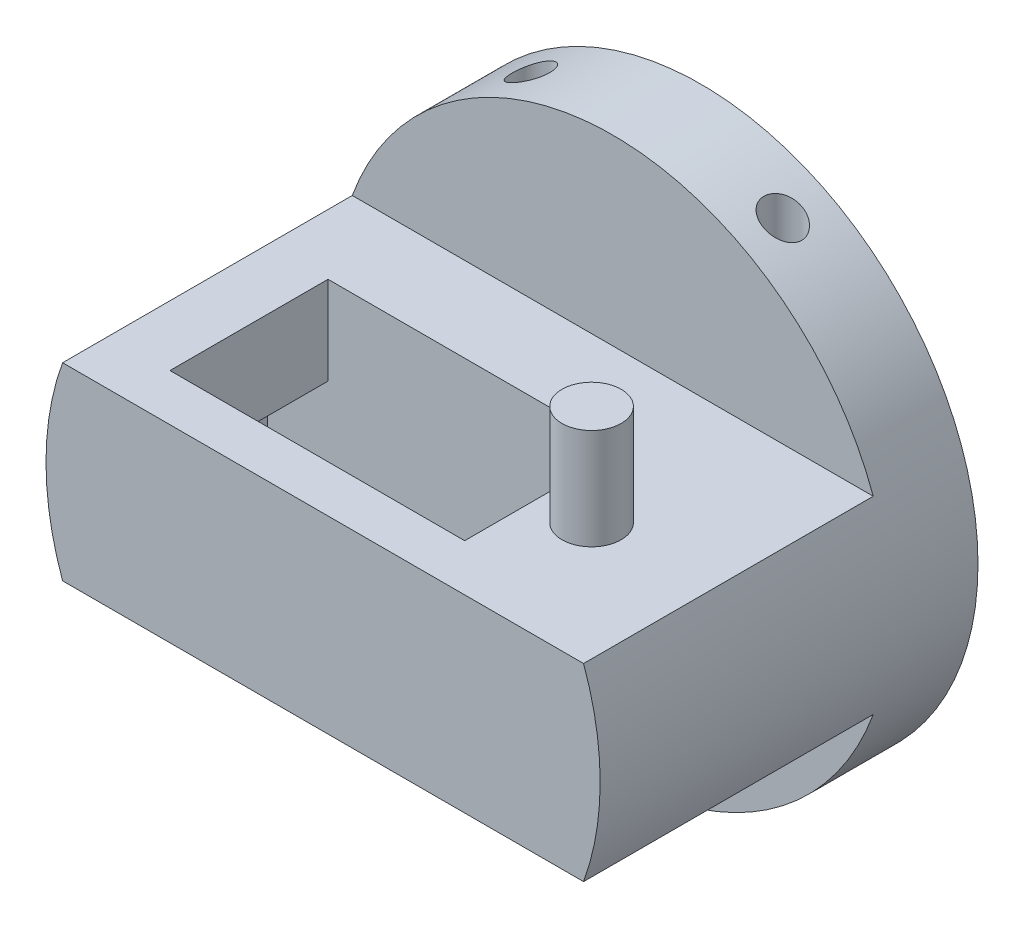
ISO-10303-21;
HEADER;
FILE_DESCRIPTION(('STEP AP214'),'2;1');
FILE_NAME('part.step','',(''),(''),'','','');
FILE_SCHEMA(('AUTOMOTIVE_DESIGN { 1 0 10303 214 1 1 1 1 }'));
ENDSEC;
DATA;
#1=APPLICATION_CONTEXT('core data for automotive mechanical design processes');
#2=APPLICATION_PROTOCOL_DEFINITION('international standard','automotive_design',2000,#1);
#3=PRODUCT_CONTEXT('',#1,'mechanical');
#4=PRODUCT('Part','Part','',(#3));
#5=PRODUCT_RELATED_PRODUCT_CATEGORY('part','',(#4));
#6=PRODUCT_DEFINITION_FORMATION('','',#4);
#7=PRODUCT_DEFINITION_CONTEXT('part definition',#1,'design');
#8=PRODUCT_DEFINITION('design','',#6,#7);
#9=PRODUCT_DEFINITION_SHAPE('','',#8);
#10=(LENGTH_UNIT() NAMED_UNIT(*) SI_UNIT(.MILLI.,.METRE.));
#11=(NAMED_UNIT(*) PLANE_ANGLE_UNIT() SI_UNIT($,.RADIAN.));
#12=(NAMED_UNIT(*) SI_UNIT($,.STERADIAN.) SOLID_ANGLE_UNIT());
#13=UNCERTAINTY_MEASURE_WITH_UNIT(LENGTH_MEASURE(1.E-05),#10,'distance_accuracy_value','');
#14=(GEOMETRIC_REPRESENTATION_CONTEXT(3) GLOBAL_UNCERTAINTY_ASSIGNED_CONTEXT((#13)) GLOBAL_UNIT_ASSIGNED_CONTEXT((#10,
#11,#12)) REPRESENTATION_CONTEXT('',''));
#15=CARTESIAN_POINT('',(0.,0.,0.));
#16=DIRECTION('',(0.,0.,1.));
#17=DIRECTION('',(1.,0.,0.));
#18=AXIS2_PLACEMENT_3D('',#15,#16,#17);
#19=CARTESIAN_POINT('',(0.,0.,10.));
#20=DIRECTION('',(0.,0.,-1.));
#21=DIRECTION('',(-1.,0.,0.));
#22=AXIS2_PLACEMENT_3D('',#19,#20,#21);
#23=CYLINDRICAL_SURFACE('',#22,22.);
#24=DIRECTION('',(0.,0.,-1.));
#25=VECTOR('',#24,1.);
#26=CARTESIAN_POINT('',(-20.6821178799464,7.5,30.));
#27=LINE('',#26,#25);
#28=CARTESIAN_POINT('',(-20.6821178799464,7.5,30.));
#29=VERTEX_POINT('',#28);
#30=CARTESIAN_POINT('',(-20.6821178799464,7.5,7.));
#31=VERTEX_POINT('',#30);
#32=EDGE_CURVE('E377',#29,#31,#27,.T.);
#33=ORIENTED_EDGE('',*,*,#32,.T.);
#34=CARTESIAN_POINT('',(0.,0.,7.));
#35=DIRECTION('',(0.,0.,1.));
#36=DIRECTION('',(1.,0.,0.));
#37=AXIS2_PLACEMENT_3D('',#34,#35,#36);
#38=CIRCLE('',#37,22.);
#39=CARTESIAN_POINT('',(20.6821178799464,7.5,7.));
#40=VERTEX_POINT('',#39);
#41=EDGE_CURVE('E253',#40,#31,#38,.T.);
#42=ORIENTED_EDGE('',*,*,#41,.F.);
#43=DIRECTION('',(0.,0.,-1.));
#44=VECTOR('',#43,1.);
#45=CARTESIAN_POINT('',(20.6821178799464,7.5,30.));
#46=LINE('',#45,#44);
#47=CARTESIAN_POINT('',(20.6821178799464,7.5,30.));
#48=VERTEX_POINT('',#47);
#49=EDGE_CURVE('E380',#48,#40,#46,.T.);
#50=ORIENTED_EDGE('',*,*,#49,.F.);
#51=CARTESIAN_POINT('',(0.,0.,30.));
#52=DIRECTION('',(0.,0.,1.));
#53=DIRECTION('',(1.,0.,0.));
#54=AXIS2_PLACEMENT_3D('',#51,#52,#53);
#55=CIRCLE('',#54,22.);
#56=CARTESIAN_POINT('',(20.6821178799464,-7.5,30.));
#57=VERTEX_POINT('',#56);
#58=EDGE_CURVE('E370',#57,#48,#55,.T.);
#59=ORIENTED_EDGE('',*,*,#58,.F.);
#60=DIRECTION('',(0.,0.,-1.));
#61=VECTOR('',#60,1.);
#62=CARTESIAN_POINT('',(20.6821178799464,-7.5,30.));
#63=LINE('',#62,#61);
#64=CARTESIAN_POINT('',(20.6821178799464,-7.5,7.));
#65=VERTEX_POINT('',#64);
#66=EDGE_CURVE('E383',#57,#65,#63,.T.);
#67=ORIENTED_EDGE('',*,*,#66,.T.);
#68=CARTESIAN_POINT('',(0.,0.,7.));
#69=DIRECTION('',(0.,0.,1.));
#70=DIRECTION('',(1.,0.,0.));
#71=AXIS2_PLACEMENT_3D('',#68,#69,#70);
#72=CIRCLE('',#71,22.);
#73=CARTESIAN_POINT('',(-20.6821178799464,-7.5,7.));
#74=VERTEX_POINT('',#73);
#75=EDGE_CURVE('E254',#74,#65,#72,.T.);
#76=ORIENTED_EDGE('',*,*,#75,.F.);
#77=DIRECTION('',(0.,0.,-1.));
#78=VECTOR('',#77,1.);
#79=CARTESIAN_POINT('',(-20.6821178799464,-7.5,30.));
#80=LINE('',#79,#78);
#81=CARTESIAN_POINT('',(-20.6821178799464,-7.5,13.725));
#82=VERTEX_POINT('',#81);
#83=EDGE_CURVE('E386',#82,#74,#80,.T.);
#84=ORIENTED_EDGE('',*,*,#83,.F.);
#85=DIRECTION('',(0.,0.,-1.));
#86=VECTOR('',#85,1.);
#87=CARTESIAN_POINT('',(-20.6821178799464,-7.5,26.275));
#88=LINE('',#87,#86);
#89=CARTESIAN_POINT('',(-20.6821178799464,-7.5,26.275));
#90=VERTEX_POINT('',#89);
#91=EDGE_CURVE('E285',#90,#82,#88,.T.);
#92=ORIENTED_EDGE('',*,*,#91,.F.);
#93=CARTESIAN_POINT('',(-20.6821178799464,-7.5,30.));
#94=VERTEX_POINT('',#93);
#95=EDGE_CURVE('E387',#94,#90,#80,.T.);
#96=ORIENTED_EDGE('',*,*,#95,.F.);
#97=CARTESIAN_POINT('',(0.,0.,30.));
#98=DIRECTION('',(0.,0.,1.));
#99=DIRECTION('',(1.,0.,0.));
#100=AXIS2_PLACEMENT_3D('',#97,#98,#99);
#101=CIRCLE('',#100,22.);
#102=EDGE_CURVE('E363',#29,#94,#101,.T.);
#103=ORIENTED_EDGE('',*,*,#102,.F.);
#104=EDGE_LOOP('',(#33,#42,#50,#59,#67,#76,#84,#92,#96,#103));
#105=FACE_BOUND('',#104,.T.);
#106=CARTESIAN_POINT('',(0.,0.,0.));
#107=DIRECTION('',(0.,0.,1.));
#108=DIRECTION('',(1.,0.,0.));
#109=AXIS2_PLACEMENT_3D('',#106,#107,#108);
#110=CIRCLE('',#109,22.);
#111=CARTESIAN_POINT('',(22.,0.,0.));
#112=VERTEX_POINT('',#111);
#113=EDGE_CURVE('E57',#112,#112,#110,.T.);
#114=ORIENTED_EDGE('',*,*,#113,.T.);
#115=EDGE_LOOP('',(#114));
#116=FACE_BOUND('',#115,.T.);
#117=CARTESIAN_POINT('',(10.,19.5959179422654,2.));
#118=CARTESIAN_POINT('',(10.0945599144638,19.5476617233591,2.00000277132168));
#119=CARTESIAN_POINT('',(10.1888572493769,19.4986700594063,2.00895642119548));
#120=CARTESIAN_POINT('',(10.3742633681053,19.4006624621111,2.04436829119968));
#121=CARTESIAN_POINT('',(10.4653657042736,19.3516466617613,2.07085997888881));
#122=CARTESIAN_POINT('',(10.641809902766,19.2551809453936,2.14092156215141));
#123=CARTESIAN_POINT('',(10.7271465496634,19.207732466428,2.18450668362655));
#124=CARTESIAN_POINT('',(10.8892471625405,19.1163007619247,2.28818815605212));
#125=CARTESIAN_POINT('',(10.9660146281444,19.0723161239436,2.3482777316867));
#126=CARTESIAN_POINT('',(11.1045670032718,18.9919642538297,2.48084369820198));
#127=CARTESIAN_POINT('',(11.166893103392,18.955333217493,2.55258969347204));
#128=CARTESIAN_POINT('',(11.2779906894623,18.8894443812978,2.70886398539963));
#129=CARTESIAN_POINT('',(11.3267786463404,18.8601776259034,2.79337655469615));
#130=CARTESIAN_POINT('',(11.4021082164994,18.8147177222607,2.96028605090954));
#131=CARTESIAN_POINT('',(11.4307856745851,18.7972806362595,3.04137756947857));
#132=CARTESIAN_POINT('',(11.473935597678,18.7709738289548,3.20855950499098));
#133=CARTESIAN_POINT('',(11.4884253986605,18.762093652129,3.29464368472483));
#134=CARTESIAN_POINT('',(11.5012560388302,18.7542301507228,3.45647019466844));
#135=CARTESIAN_POINT('',(11.501543130853,18.7540540723857,3.53200730873907));
#136=CARTESIAN_POINT('',(11.4908170032419,18.7606280602526,3.68195724536723));
#137=CARTESIAN_POINT('',(11.4798063057587,18.7673765805893,3.75637031509728));
#138=CARTESIAN_POINT('',(11.4477273067475,18.7869601026889,3.89903398727969));
#139=CARTESIAN_POINT('',(11.4270661761699,18.7995485714221,3.96741168176921));
#140=CARTESIAN_POINT('',(11.3767972435944,18.8300117919057,4.09952314502058));
#141=CARTESIAN_POINT('',(11.3471876617407,18.847887595297,4.1632559867838));
#142=CARTESIAN_POINT('',(11.2777559119676,18.88952004037,4.28922314119585));
#143=CARTESIAN_POINT('',(11.237358281522,18.913603904251,4.35103042877757));
#144=CARTESIAN_POINT('',(11.1489901201406,18.9658285788209,4.46702933701363));
#145=CARTESIAN_POINT('',(11.1010161200743,18.993971247474,4.52121744734453));
#146=CARTESIAN_POINT('',(10.9920906469071,19.057240180328,4.62796660515914));
#147=CARTESIAN_POINT('',(10.9302622094075,19.0927981313524,4.67937643446575));
#148=CARTESIAN_POINT('',(10.8003311136826,19.1665969741016,4.77114325699679));
#149=CARTESIAN_POINT('',(10.7322251078219,19.2048392946964,4.81149430680802));
#150=CARTESIAN_POINT('',(10.5820707839074,19.2880288364449,4.88530573161734));
#151=CARTESIAN_POINT('',(10.4993631038712,19.3331995594281,4.91717856155254));
#152=CARTESIAN_POINT('',(10.3299809356528,19.42423104289,4.96590806039183));
#153=CARTESIAN_POINT('',(10.2433046640021,19.4700921072661,4.98275790699468));
#154=CARTESIAN_POINT('',(10.0617685278243,19.5645598069504,5.00169671129556));
#155=CARTESIAN_POINT('',(9.96676664594288,19.6131282984705,5.00264412983747));
#156=CARTESIAN_POINT('',(9.77727669968517,19.7082749364856,4.98641695874894));
#157=CARTESIAN_POINT('',(9.68278867144391,19.7548529445467,4.96924111081093));
#158=CARTESIAN_POINT('',(9.49877122419144,19.8439824220575,4.91696020400471));
#159=CARTESIAN_POINT('',(9.40918809267238,19.8865845494401,4.88213316600253));
#160=CARTESIAN_POINT('',(9.23675816080716,19.9672570259774,4.79490595693299));
#161=CARTESIAN_POINT('',(9.15390799719161,20.0053296421898,4.74251462749912));
#162=CARTESIAN_POINT('',(9.00488701415406,20.072821611278,4.62603511187165));
#163=CARTESIAN_POINT('',(8.93790750439065,20.1026930364634,4.56324589868109));
#164=CARTESIAN_POINT('',(8.81561712774016,20.1566209560408,4.42505700713617));
#165=CARTESIAN_POINT('',(8.7602980813605,20.180681528324,4.34966623543493));
#166=CARTESIAN_POINT('',(8.66879851652325,20.2201429080683,4.19647044346663));
#167=CARTESIAN_POINT('',(8.63127365750027,20.2361613180168,4.11962617397148));
#168=CARTESIAN_POINT('',(8.56964863723025,20.2623358421583,3.95980145735956));
#169=CARTESIAN_POINT('',(8.54554163798451,20.2724949424636,3.87682416022052));
#170=CARTESIAN_POINT('',(8.51313186799729,20.2861251032923,3.71363060137874));
#171=CARTESIAN_POINT('',(8.50380813858903,20.29002843789,3.63365172066174));
#172=CARTESIAN_POINT('',(8.49809391237988,20.2924225313826,3.47315974930723));
#173=CARTESIAN_POINT('',(8.50170042444708,20.2909145420702,3.39264678651902));
#174=CARTESIAN_POINT('',(8.52138752782426,20.2826541573358,3.23586964374048));
#175=CARTESIAN_POINT('',(8.53709750042895,20.2760575718431,3.15955017122157));
#176=CARTESIAN_POINT('',(8.57990584370362,20.2579799340658,3.01079310320755));
#177=CARTESIAN_POINT('',(8.60700439271862,20.2464988052894,2.93835556852358));
#178=CARTESIAN_POINT('',(8.67203145009845,20.218732201181,2.79817485179825));
#179=CARTESIAN_POINT('',(8.71011496689784,20.2023778421919,2.73051746385549));
#180=CARTESIAN_POINT('',(8.79554403590597,20.1653308230918,2.60267031193175));
#181=CARTESIAN_POINT('',(8.84289086562806,20.1446375645703,2.54248157983425));
#182=CARTESIAN_POINT('',(8.94801870597528,20.0981698010822,2.42775591793143));
#183=CARTESIAN_POINT('',(9.00622212835657,20.0721828381015,2.37369296296075));
#184=CARTESIAN_POINT('',(9.12929019153241,20.0165087456157,2.27605477447905));
#185=CARTESIAN_POINT('',(9.19415869937583,19.9868194658863,2.23248567903175));
#186=CARTESIAN_POINT('',(9.33424397597241,19.9218052985254,2.15323774359865));
#187=CARTESIAN_POINT('',(9.40987298300966,19.8862175837769,2.11850561850403));
#188=CARTESIAN_POINT('',(9.56452620558279,19.8122984521189,2.06224927299177));
#189=CARTESIAN_POINT('',(9.64354757838293,19.7739693151942,2.040714216256));
#190=CARTESIAN_POINT('',(9.76912958405098,19.7120961797679,2.01713799577536));
#191=CARTESIAN_POINT('',(9.81522550256717,19.6891851827586,2.01070213572317));
#192=CARTESIAN_POINT('',(9.90756849587035,19.6428805765565,2.00213251352177));
#193=CARTESIAN_POINT('',(9.95381556694314,19.6194869791485,1.99999864644632));
#194=CARTESIAN_POINT('',(10.,19.5959179422654,2.));
#195=B_SPLINE_CURVE_WITH_KNOTS('',3,(#117,#118,#119,#120,#121,#122,#123,#124,#125,#126,#127,
#128,#129,#130,#131,#132,#133,#134,#135,#136,#137,#138,#139,#140,#141,#142,#143,#144,#145,#146,
#147,#148,#149,#150,#151,#152,#153,#154,#155,#156,#157,#158,#159,#160,#161,#162,#163,#164,#165,
#166,#167,#168,#169,#170,#171,#172,#173,#174,#175,#176,#177,#178,#179,#180,#181,#182,#183,#184,
#185,#186,#187,#188,#189,#190,#191,#192,#193,#194),.UNSPECIFIED.,.T.,.F.,(4,2,2,2,2,2,2,2,2,2,2,
2,2,2,2,2,2,2,2,2,2,2,2,2,2,2,2,2,2,2,2,2,2,2,2,2,2,2,4),(0.,0.31829568389451,0.637200524001362,
0.956390074746361,1.27544878892674,1.57923871318421,1.88265740025599,2.1443776628594,
2.40577772747875,2.63124133464282,2.85665461961719,3.07331443338872,3.290017369401,
3.52209290189501,3.75427500880395,4.01699235355372,4.27985061705031,4.57702883267423,
4.87434193549777,5.19291283809618,5.51150586068938,5.82522987841004,6.13879620811845,
6.4268427964944,6.71468665073848,6.97432010877928,7.23382113119862,7.47446900879699,
7.71506122130202,7.94856554419172,8.18207352389368,8.41905280952722,8.6560648002933,
8.90574376141592,9.15556841190032,9.42599078179821,9.69619080511277,9.85165482328841,
10.0071150496272),.UNSPECIFIED.);
#196=CARTESIAN_POINT('',(10.,19.5959179422654,2.));
#197=VERTEX_POINT('',#196);
#198=EDGE_CURVE('E843',#197,#197,#195,.T.);
#199=ORIENTED_EDGE('',*,*,#198,.T.);
#200=EDGE_LOOP('',(#199));
#201=FACE_BOUND('',#200,.T.);
#202=CARTESIAN_POINT('',(-10.,19.5959179422654,2.));
#203=CARTESIAN_POINT('',(-9.90978152514876,19.6419563102293,2.00000263761842));
#204=CARTESIAN_POINT('',(-9.81917891634582,19.6873998083297,2.00815059606973));
#205=CARTESIAN_POINT('',(-9.63971085702007,19.7758946414396,2.04105294540015));
#206=CARTESIAN_POINT('',(-9.55084740153323,19.8189433228702,2.06582537519941));
#207=CARTESIAN_POINT('',(-9.37743008946667,19.9015842578455,2.13213770125119));
#208=CARTESIAN_POINT('',(-9.29289125443842,19.9411647646407,2.17373209077043));
#209=CARTESIAN_POINT('',(-9.13165632109446,20.0155123573942,2.27324035869228));
#210=CARTESIAN_POINT('',(-9.05495524380931,20.0502825041859,2.33114378776712));
#211=CARTESIAN_POINT('',(-8.91824003878005,20.1114440991231,2.45704314627345));
#212=CARTESIAN_POINT('',(-8.85739722903451,20.1382736550078,2.52392427597652));
#213=CARTESIAN_POINT('',(-8.74799366832809,20.1860392513366,2.66891019075304));
#214=CARTESIAN_POINT('',(-8.69942519050644,20.2069790004378,2.74700786604496));
#215=CARTESIAN_POINT('',(-8.62089437557546,20.2405987518945,2.90414546296527));
#216=CARTESIAN_POINT('',(-8.5896065451536,20.2538727328897,2.98239734036616));
#217=CARTESIAN_POINT('',(-8.54048687796579,20.2746345100014,3.14373982789983));
#218=CARTESIAN_POINT('',(-8.5226489433493,20.2821249282794,3.22682822684545));
#219=CARTESIAN_POINT('',(-8.50195271404499,20.2908086511677,3.38972222433783));
#220=CARTESIAN_POINT('',(-8.49820682374747,20.2923751155959,3.46939645311095));
#221=CARTESIAN_POINT('',(-8.50338278911663,20.2902067472983,3.62825164717533));
#222=CARTESIAN_POINT('',(-8.51230240751398,20.2864728508425,3.70743269710171));
#223=CARTESIAN_POINT('',(-8.54212586960535,20.2739324292548,3.86143422942812));
#224=CARTESIAN_POINT('',(-8.56278881377846,20.2652278546743,3.93631002033915));
#225=CARTESIAN_POINT('',(-8.61509374975968,20.243047233825,4.08136044448506));
#226=CARTESIAN_POINT('',(-8.64673632020225,20.2295709360821,4.15153482971978));
#227=CARTESIAN_POINT('',(-8.72069024831087,20.1978021535423,4.28706184999001));
#228=CARTESIAN_POINT('',(-8.7632364645397,20.1794031941079,4.35226098730323));
#229=CARTESIAN_POINT('',(-8.85707813153295,20.1383908122469,4.47451140692915));
#230=CARTESIAN_POINT('',(-8.90837550263779,20.1157764647006,4.53156089583572));
#231=CARTESIAN_POINT('',(-9.02140561278876,20.065350464365,4.63966337260073));
#232=CARTESIAN_POINT('',(-9.08358259388585,20.0373067624347,4.69014272736517));
#233=CARTESIAN_POINT('',(-9.21395550953788,19.9776916676101,4.78000372480069));
#234=CARTESIAN_POINT('',(-9.28215346276573,19.9461190906265,4.81938162675089));
#235=CARTESIAN_POINT('',(-9.42873925432424,19.8772727310227,4.88953824927151));
#236=CARTESIAN_POINT('',(-9.50749910829111,19.8397421692448,4.91928697722613));
#237=CARTESIAN_POINT('',(-9.66770729643166,19.7621701500498,4.96510473184768));
#238=CARTESIAN_POINT('',(-9.74915670322921,19.722127684987,4.98116823054344));
#239=CARTESIAN_POINT('',(-9.92016664868305,19.6367059433912,5.00056075993962));
#240=CARTESIAN_POINT('',(-10.0097956449172,19.5911712143673,5.00260928354878));
#241=CARTESIAN_POINT('',(-10.1876107603225,19.4992978863367,4.99088879007363));
#242=CARTESIAN_POINT('',(-10.2757962849672,19.4529589715303,4.97711341395093));
#243=CARTESIAN_POINT('',(-10.4537344058986,19.3579491628165,4.93283726429454));
#244=CARTESIAN_POINT('',(-10.5432669374332,19.3093039622513,4.90138823010797));
#245=CARTESIAN_POINT('',(-10.7157705162537,19.2141087441376,4.82162934071272));
#246=CARTESIAN_POINT('',(-10.7987397669848,19.1675593017493,4.77331488841893));
#247=CARTESIAN_POINT('',(-10.954105893637,19.0791883710415,4.66133794453468));
#248=CARTESIAN_POINT('',(-11.0266491952284,19.0373037629019,4.59793021398549));
#249=CARTESIAN_POINT('',(-11.1596583741355,18.9596402777455,4.4563480649745));
#250=CARTESIAN_POINT('',(-11.2201341532493,18.9238563984205,4.37818585639036));
#251=CARTESIAN_POINT('',(-11.3197081485585,18.8644427393457,4.21847497142941));
#252=CARTESIAN_POINT('',(-11.3604450713667,18.839898973905,4.1382941608866));
#253=CARTESIAN_POINT('',(-11.427302979191,18.7994227368029,3.97006539426956));
#254=CARTESIAN_POINT('',(-11.4534460170684,18.7834772734706,3.8820295427535));
#255=CARTESIAN_POINT('',(-11.4865476532932,18.7632496363494,3.71515214829064));
#256=CARTESIAN_POINT('',(-11.4958079953846,18.757569283433,3.63693108218859));
#257=CARTESIAN_POINT('',(-11.5019187481538,18.7538231823631,3.47983527479574));
#258=CARTESIAN_POINT('',(-11.4987753626677,18.7557536275999,3.40096087996777));
#259=CARTESIAN_POINT('',(-11.4810346094527,18.7666175163043,3.25151836172572));
#260=CARTESIAN_POINT('',(-11.467379061251,18.7749750730913,3.18079249057541));
#261=CARTESIAN_POINT('',(-11.4304348725199,18.7974898056613,3.0428864383009));
#262=CARTESIAN_POINT('',(-11.4071454376562,18.8116474596735,2.97570655006562));
#263=CARTESIAN_POINT('',(-11.3509332830635,18.8456208138257,2.844035691498));
#264=CARTESIAN_POINT('',(-11.3176933643722,18.8656221956739,2.77972914004666));
#265=CARTESIAN_POINT('',(-11.243211641217,18.9101050022192,2.65765588620122));
#266=CARTESIAN_POINT('',(-11.2019671150525,18.9345879505625,2.59989141883423));
#267=CARTESIAN_POINT('',(-11.1075240582012,18.9901617285196,2.48534560822392));
#268=CARTESIAN_POINT('',(-11.0534922979827,19.0216902296084,2.42946507417624));
#269=CARTESIAN_POINT('',(-10.9386259266175,19.0879769954196,2.32744219686417));
#270=CARTESIAN_POINT('',(-10.8777860990515,19.1227377332237,2.2813074001381));
#271=CARTESIAN_POINT('',(-10.7419556858969,19.199408144623,2.1935101856353));
#272=CARTESIAN_POINT('',(-10.6661726999431,19.241640758108,2.1533549292299));
#273=CARTESIAN_POINT('',(-10.5096796473028,19.3275603922826,2.08668650921503));
#274=CARTESIAN_POINT('',(-10.4289727099257,19.3712464813832,2.06016478009465));
#275=CARTESIAN_POINT('',(-10.2900250760151,19.4452957906227,2.02715097183643));
#276=CARTESIAN_POINT('',(-10.2325876930005,19.4755849207573,2.01699689698732));
#277=CARTESIAN_POINT('',(-10.116820741086,19.5359720384731,2.00342028885807));
#278=CARTESIAN_POINT('',(-10.0584911017303,19.5660700106914,1.99999828995993));
#279=CARTESIAN_POINT('',(-10.,19.5959179422654,2.));
#280=B_SPLINE_CURVE_WITH_KNOTS('',3,(#202,#203,#204,#205,#206,#207,#208,#209,#210,#211,#212,
#213,#214,#215,#216,#217,#218,#219,#220,#221,#222,#223,#224,#225,#226,#227,#228,#229,#230,#231,
#232,#233,#234,#235,#236,#237,#238,#239,#240,#241,#242,#243,#244,#245,#246,#247,#248,#249,#250,
#251,#252,#253,#254,#255,#256,#257,#258,#259,#260,#261,#262,#263,#264,#265,#266,#267,#268,#269,
#270,#271,#272,#273,#274,#275,#276,#277,#278,#279),.UNSPECIFIED.,.T.,.F.,(4,2,2,2,2,2,2,2,2,2,2,
2,2,2,2,2,2,2,2,2,2,2,2,2,2,2,2,2,2,2,2,2,2,2,2,2,2,2,4),(0.,0.303635344412007,0.60760069203885,
0.912558698284608,1.21732175831144,1.49870844047222,1.77991754211745,2.03452427827129,
2.28901551249633,2.5271799553692,2.76530233347125,2.99870766866338,3.23212530635902,
3.47106938315027,3.71006596107925,3.96355940555265,4.21713816480014,4.49251189572451,
4.76799680763363,5.06835098421231,5.36882590423246,5.68721628737807,6.00569352351833,
6.31913502975399,6.63231827969585,6.91030355411244,7.18786761915147,7.42349539142967,
7.65900532729253,7.87556844887237,8.09214943009942,8.31654322198657,8.54101344561742,
8.79166988751047,9.04251971756745,9.32815247551923,9.61360555950452,9.81044502345899,
10.0073001116014),.UNSPECIFIED.);
#281=CARTESIAN_POINT('',(-10.,19.5959179422654,2.));
#282=VERTEX_POINT('',#281);
#283=EDGE_CURVE('E851',#282,#282,#280,.T.);
#284=ORIENTED_EDGE('',*,*,#283,.T.);
#285=EDGE_LOOP('',(#284));
#286=FACE_BOUND('',#285,.T.);
#287=ADVANCED_FACE('F49',(#105,#116,#201,#286),#23,.T.);
#288=CARTESIAN_POINT('',(-15.8821178799464,34.0530130117092,13.725));
#289=DIRECTION('',(-1.,0.,0.));
#290=DIRECTION('',(0.,0.,1.));
#291=AXIS2_PLACEMENT_3D('',#288,#289,#290);
#292=PLANE('',#291);
#293=DIRECTION('',(0.,0.,-1.));
#294=VECTOR('',#293,1.);
#295=CARTESIAN_POINT('',(-15.8821178799464,0.499999999999976,26.075));
#296=LINE('',#295,#294);
#297=CARTESIAN_POINT('',(-15.8821178799464,0.499999999999976,26.275));
#298=VERTEX_POINT('',#297);
#299=CARTESIAN_POINT('',(-15.8821178799464,0.499999999999976,13.725));
#300=VERTEX_POINT('',#299);
#301=EDGE_CURVE('E360',#298,#300,#296,.T.);
#302=ORIENTED_EDGE('',*,*,#301,.T.);
#303=DIRECTION('',(0.,-1.,0.));
#304=VECTOR('',#303,1.);
#305=CARTESIAN_POINT('',(-15.8821178799464,34.0530130117092,13.725));
#306=LINE('',#305,#304);
#307=CARTESIAN_POINT('',(-15.8821178799464,7.5,13.725));
#308=VERTEX_POINT('',#307);
#309=EDGE_CURVE('E344',#308,#300,#306,.T.);
#310=ORIENTED_EDGE('',*,*,#309,.F.);
#311=DIRECTION('',(0.,0.,-1.));
#312=VECTOR('',#311,1.);
#313=CARTESIAN_POINT('',(-15.8821178799464,7.5,13.725));
#314=LINE('',#313,#312);
#315=CARTESIAN_POINT('',(-15.8821178799464,7.50000000000001,26.275));
#316=VERTEX_POINT('',#315);
#317=EDGE_CURVE('E345',#316,#308,#314,.T.);
#318=ORIENTED_EDGE('',*,*,#317,.F.);
#319=DIRECTION('',(0.,-1.,0.));
#320=VECTOR('',#319,1.);
#321=CARTESIAN_POINT('',(-15.8821178799464,34.0530130117092,26.275));
#322=LINE('',#321,#320);
#323=EDGE_CURVE('E334',#316,#298,#322,.T.);
#324=ORIENTED_EDGE('',*,*,#323,.T.);
#325=EDGE_LOOP('',(#302,#310,#318,#324));
#326=FACE_BOUND('',#325,.T.);
#327=ADVANCED_FACE('F413',(#326),#292,.F.);
#328=CARTESIAN_POINT('',(7.51788212005355,34.0530130117092,13.725));
#329=DIRECTION('',(1.,0.,0.));
#330=DIRECTION('',(0.,0.,-1.));
#331=AXIS2_PLACEMENT_3D('',#328,#329,#330);
#332=PLANE('',#331);
#333=DIRECTION('',(0.,0.,1.));
#334=VECTOR('',#333,1.);
#335=CARTESIAN_POINT('',(7.51788212005355,0.5,26.075));
#336=LINE('',#335,#334);
#337=CARTESIAN_POINT('',(7.51788212005355,0.499999999999976,13.725));
#338=VERTEX_POINT('',#337);
#339=CARTESIAN_POINT('',(7.51788212005355,0.499999999999976,26.275));
#340=VERTEX_POINT('',#339);
#341=EDGE_CURVE('E11',#338,#340,#336,.T.);
#342=ORIENTED_EDGE('',*,*,#341,.T.);
#343=DIRECTION('',(0.,-1.,0.));
#344=VECTOR('',#343,1.);
#345=CARTESIAN_POINT('',(7.51788212005355,34.0530130117092,26.275));
#346=LINE('',#345,#344);
#347=CARTESIAN_POINT('',(7.51788212005355,7.5,26.275));
#348=VERTEX_POINT('',#347);
#349=EDGE_CURVE('E77',#348,#340,#346,.T.);
#350=ORIENTED_EDGE('',*,*,#349,.F.);
#351=DIRECTION('',(0.,0.,1.));
#352=VECTOR('',#351,1.);
#353=CARTESIAN_POINT('',(7.51788212005355,7.5,13.725));
#354=LINE('',#353,#352);
#355=CARTESIAN_POINT('',(7.51788212005355,7.5,13.725));
#356=VERTEX_POINT('',#355);
#357=EDGE_CURVE('E335',#356,#348,#354,.T.);
#358=ORIENTED_EDGE('',*,*,#357,.F.);
#359=DIRECTION('',(0.,-1.,0.));
#360=VECTOR('',#359,1.);
#361=CARTESIAN_POINT('',(7.51788212005355,34.0530130117092,13.725));
#362=LINE('',#361,#360);
#363=EDGE_CURVE('E339',#356,#338,#362,.T.);
#364=ORIENTED_EDGE('',*,*,#363,.T.);
#365=EDGE_LOOP('',(#342,#350,#358,#364));
#366=FACE_BOUND('',#365,.T.);
#367=ADVANCED_FACE('F410',(#366),#332,.F.);
#368=CARTESIAN_POINT('',(0.,-7.5,30.));
#369=DIRECTION('',(0.,1.,0.));
#370=DIRECTION('',(0.,0.,1.));
#371=AXIS2_PLACEMENT_3D('',#368,#369,#370);
#372=PLANE('',#371);
#373=ORIENTED_EDGE('',*,*,#95,.T.);
#374=DIRECTION('',(-1.,0.,0.));
#375=VECTOR('',#374,1.);
#376=CARTESIAN_POINT('',(-15.8821178799464,-7.5,26.275));
#377=LINE('',#376,#375);
#378=CARTESIAN_POINT('',(12.0678821200536,-7.5,26.275));
#379=VERTEX_POINT('',#378);
#380=EDGE_CURVE('E300',#379,#90,#377,.T.);
#381=ORIENTED_EDGE('',*,*,#380,.F.);
#382=DIRECTION('',(0.,0.,1.));
#383=VECTOR('',#382,1.);
#384=CARTESIAN_POINT('',(12.0678821200536,-7.5,13.725));
#385=LINE('',#384,#383);
#386=CARTESIAN_POINT('',(12.0678821200536,-7.5,13.725));
#387=VERTEX_POINT('',#386);
#388=EDGE_CURVE('E290',#387,#379,#385,.T.);
#389=ORIENTED_EDGE('',*,*,#388,.F.);
#390=DIRECTION('',(1.,0.,0.));
#391=VECTOR('',#390,1.);
#392=CARTESIAN_POINT('',(-15.8821178799464,-7.5,13.725));
#393=LINE('',#392,#391);
#394=EDGE_CURVE('E325',#82,#387,#393,.T.);
#395=ORIENTED_EDGE('',*,*,#394,.F.);
#396=ORIENTED_EDGE('',*,*,#83,.T.);
#397=DIRECTION('',(-1.,0.,0.));
#398=VECTOR('',#397,1.);
#399=CARTESIAN_POINT('',(0.,-7.5,7.));
#400=LINE('',#399,#398);
#401=EDGE_CURVE('E248',#65,#74,#400,.T.);
#402=ORIENTED_EDGE('',*,*,#401,.F.);
#403=ORIENTED_EDGE('',*,*,#66,.F.);
#404=DIRECTION('',(1.,0.,0.));
#405=VECTOR('',#404,1.);
#406=CARTESIAN_POINT('',(0.,-7.5,30.));
#407=LINE('',#406,#405);
#408=EDGE_CURVE('E367',#94,#57,#407,.T.);
#409=ORIENTED_EDGE('',*,*,#408,.F.);
#410=EDGE_LOOP('',(#373,#381,#389,#395,#396,#402,#403,#409));
#411=FACE_BOUND('',#410,.T.);
#412=ADVANCED_FACE('F400',(#411),#372,.F.);
#413=CARTESIAN_POINT('',(0.,0.,0.));
#414=DIRECTION('',(0.,0.,1.));
#415=DIRECTION('',(1.,0.,0.));
#416=AXIS2_PLACEMENT_3D('',#413,#414,#415);
#417=PLANE('',#416);
#418=DIRECTION('',(0.993677769076435,0.112269725408412,0.));
#419=VECTOR('',#418,1.);
#420=CARTESIAN_POINT('',(0.439535974973931,-3.89024846593424,0.));
#421=LINE('',#420,#419);
#422=CARTESIAN_POINT('',(0.439535974973931,-3.89024846593424,0.));
#423=VERTEX_POINT('',#422);
#424=CARTESIAN_POINT('',(14.6432203684393,-2.2854588688758,0.));
#425=VERTEX_POINT('',#424);
#426=EDGE_CURVE('E197',#423,#425,#421,.T.);
#427=ORIENTED_EDGE('',*,*,#426,.T.);
#428=CARTESIAN_POINT('',(14.385,0.,0.));
#429=DIRECTION('',(0.,0.,-1.));
#430=DIRECTION('',(-1.,0.,0.));
#431=AXIS2_PLACEMENT_3D('',#428,#429,#430);
#432=CIRCLE('',#431,2.3);
#433=CARTESIAN_POINT('',(14.6432203684393,2.2854588688758,0.));
#434=VERTEX_POINT('',#433);
#435=EDGE_CURVE('E67',#434,#425,#432,.T.);
#436=ORIENTED_EDGE('',*,*,#435,.F.);
#437=DIRECTION('',(-0.993677769076435,0.112269725408412,0.));
#438=VECTOR('',#437,1.);
#439=CARTESIAN_POINT('',(0.439535974973932,3.89024846593424,0.));
#440=LINE('',#439,#438);
#441=CARTESIAN_POINT('',(0.439535974973931,3.89024846593424,0.));
#442=VERTEX_POINT('',#441);
#443=EDGE_CURVE('E219',#434,#442,#440,.T.);
#444=ORIENTED_EDGE('',*,*,#443,.T.);
#445=CARTESIAN_POINT('',(0.,0.,0.));
#446=DIRECTION('',(0.,0.,-1.));
#447=DIRECTION('',(-1.,0.,0.));
#448=AXIS2_PLACEMENT_3D('',#445,#446,#447);
#449=CIRCLE('',#448,3.915);
#450=EDGE_CURVE('E234',#423,#442,#449,.T.);
#451=ORIENTED_EDGE('',*,*,#450,.F.);
#452=EDGE_LOOP('',(#427,#436,#444,#451));
#453=FACE_BOUND('',#452,.T.);
#454=ORIENTED_EDGE('',*,*,#113,.F.);
#455=EDGE_LOOP('',(#454));
#456=FACE_BOUND('',#455,.T.);
#457=ADVANCED_FACE('F397',(#453,#456),#417,.F.);
#458=CARTESIAN_POINT('',(0.,7.5,30.));
#459=DIRECTION('',(0.,1.,0.));
#460=DIRECTION('',(0.,0.,1.));
#461=AXIS2_PLACEMENT_3D('',#458,#459,#460);
#462=PLANE('',#461);
#463=CARTESIAN_POINT('',(11.3178821200536,7.5,20.));
#464=DIRECTION('',(0.,1.,0.));
#465=DIRECTION('',(0.,0.,1.));
#466=AXIS2_PLACEMENT_3D('',#463,#464,#465);
#467=CIRCLE('',#466,2.35);
#468=CARTESIAN_POINT('',(11.3178821200536,7.5,22.35));
#469=VERTEX_POINT('',#468);
#470=EDGE_CURVE('E863',#469,#469,#467,.T.);
#471=ORIENTED_EDGE('',*,*,#470,.F.);
#472=EDGE_LOOP('',(#471));
#473=FACE_BOUND('',#472,.T.);
#474=DIRECTION('',(-1.,0.,0.));
#475=VECTOR('',#474,1.);
#476=CARTESIAN_POINT('',(-15.8821178799464,7.5,26.275));
#477=LINE('',#476,#475);
#478=EDGE_CURVE('E328',#348,#316,#477,.T.);
#479=ORIENTED_EDGE('',*,*,#478,.T.);
#480=ORIENTED_EDGE('',*,*,#317,.T.);
#481=DIRECTION('',(1.,0.,0.));
#482=VECTOR('',#481,1.);
#483=CARTESIAN_POINT('',(-15.8821178799464,7.5,13.725));
#484=LINE('',#483,#482);
#485=EDGE_CURVE('E340',#308,#356,#484,.T.);
#486=ORIENTED_EDGE('',*,*,#485,.T.);
#487=ORIENTED_EDGE('',*,*,#357,.T.);
#488=EDGE_LOOP('',(#479,#480,#486,#487));
#489=FACE_BOUND('',#488,.T.);
#490=ORIENTED_EDGE('',*,*,#49,.T.);
#491=DIRECTION('',(1.,0.,0.));
#492=VECTOR('',#491,1.);
#493=CARTESIAN_POINT('',(0.,7.5,7.));
#494=LINE('',#493,#492);
#495=EDGE_CURVE('E249',#31,#40,#494,.T.);
#496=ORIENTED_EDGE('',*,*,#495,.F.);
#497=ORIENTED_EDGE('',*,*,#32,.F.);
#498=DIRECTION('',(1.,0.,0.));
#499=VECTOR('',#498,1.);
#500=CARTESIAN_POINT('',(0.,7.5,30.));
#501=LINE('',#500,#499);
#502=EDGE_CURVE('E373',#29,#48,#501,.T.);
#503=ORIENTED_EDGE('',*,*,#502,.T.);
#504=EDGE_LOOP('',(#490,#496,#497,#503));
#505=FACE_BOUND('',#504,.T.);
#506=ADVANCED_FACE('F399',(#473,#489,#505),#462,.T.);
#507=CARTESIAN_POINT('',(0.,0.,30.));
#508=DIRECTION('',(0.,0.,1.));
#509=DIRECTION('',(1.,0.,0.));
#510=AXIS2_PLACEMENT_3D('',#507,#508,#509);
#511=PLANE('',#510);
#512=ORIENTED_EDGE('',*,*,#102,.T.);
#513=ORIENTED_EDGE('',*,*,#408,.T.);
#514=ORIENTED_EDGE('',*,*,#58,.T.);
#515=ORIENTED_EDGE('',*,*,#502,.F.);
#516=EDGE_LOOP('',(#512,#513,#514,#515));
#517=FACE_BOUND('',#516,.T.);
#518=ADVANCED_FACE('F406',(#517),#511,.T.);
#519=CARTESIAN_POINT('',(-15.8821178799464,34.0530130117092,26.275));
#520=DIRECTION('',(0.,0.,1.));
#521=DIRECTION('',(1.,0.,0.));
#522=AXIS2_PLACEMENT_3D('',#519,#520,#521);
#523=PLANE('',#522);
#524=ORIENTED_EDGE('',*,*,#349,.T.);
#525=DIRECTION('',(1.,0.,0.));
#526=VECTOR('',#525,1.);
#527=CARTESIAN_POINT('',(7.51788212005355,0.499999999999976,26.275));
#528=LINE('',#527,#526);
#529=CARTESIAN_POINT('',(12.0678821200536,0.499999999999976,26.275));
#530=VERTEX_POINT('',#529);
#531=EDGE_CURVE('E317',#340,#530,#528,.T.);
#532=ORIENTED_EDGE('',*,*,#531,.T.);
#533=DIRECTION('',(0.,-1.,0.));
#534=VECTOR('',#533,1.);
#535=CARTESIAN_POINT('',(12.0678821200536,13.9366104356716,26.275));
#536=LINE('',#535,#534);
#537=EDGE_CURVE('E309',#530,#379,#536,.T.);
#538=ORIENTED_EDGE('',*,*,#537,.T.);
#539=ORIENTED_EDGE('',*,*,#380,.T.);
#540=DIRECTION('',(0.,-1.,0.));
#541=VECTOR('',#540,1.);
#542=CARTESIAN_POINT('',(-20.6821178799464,13.9366104356716,26.275));
#543=LINE('',#542,#541);
#544=CARTESIAN_POINT('',(-20.6821178799464,0.499999999999976,26.275));
#545=VERTEX_POINT('',#544);
#546=EDGE_CURVE('E289',#545,#90,#543,.T.);
#547=ORIENTED_EDGE('',*,*,#546,.F.);
#548=DIRECTION('',(1.,0.,0.));
#549=VECTOR('',#548,1.);
#550=CARTESIAN_POINT('',(-15.8821178799464,0.499999999999976,26.275));
#551=LINE('',#550,#549);
#552=EDGE_CURVE('E273',#545,#298,#551,.T.);
#553=ORIENTED_EDGE('',*,*,#552,.T.);
#554=ORIENTED_EDGE('',*,*,#323,.F.);
#555=ORIENTED_EDGE('',*,*,#478,.F.);
#556=EDGE_LOOP('',(#524,#532,#538,#539,#547,#553,#554,#555));
#557=FACE_BOUND('',#556,.T.);
#558=ADVANCED_FACE('F471',(#557),#523,.F.);
#559=CARTESIAN_POINT('',(-15.8821178799464,34.0530130117092,13.725));
#560=DIRECTION('',(0.,0.,-1.));
#561=DIRECTION('',(-1.,0.,0.));
#562=AXIS2_PLACEMENT_3D('',#559,#560,#561);
#563=PLANE('',#562);
#564=ORIENTED_EDGE('',*,*,#309,.T.);
#565=DIRECTION('',(-1.,0.,0.));
#566=VECTOR('',#565,1.);
#567=CARTESIAN_POINT('',(-15.8821178799464,0.499999999999976,13.725));
#568=LINE('',#567,#566);
#569=CARTESIAN_POINT('',(-20.6821178799464,0.499999999999976,13.725));
#570=VERTEX_POINT('',#569);
#571=EDGE_CURVE('E278',#300,#570,#568,.T.);
#572=ORIENTED_EDGE('',*,*,#571,.T.);
#573=DIRECTION('',(0.,-1.,0.));
#574=VECTOR('',#573,1.);
#575=CARTESIAN_POINT('',(-20.6821178799464,13.9366104356716,13.725));
#576=LINE('',#575,#574);
#577=EDGE_CURVE('E282',#570,#82,#576,.T.);
#578=ORIENTED_EDGE('',*,*,#577,.T.);
#579=ORIENTED_EDGE('',*,*,#394,.T.);
#580=DIRECTION('',(0.,-1.,0.));
#581=VECTOR('',#580,1.);
#582=CARTESIAN_POINT('',(12.0678821200536,13.9366104356716,13.725));
#583=LINE('',#582,#581);
#584=CARTESIAN_POINT('',(12.0678821200536,0.499999999999976,13.725));
#585=VERTEX_POINT('',#584);
#586=EDGE_CURVE('E305',#585,#387,#583,.T.);
#587=ORIENTED_EDGE('',*,*,#586,.F.);
#588=DIRECTION('',(-1.,0.,0.));
#589=VECTOR('',#588,1.);
#590=CARTESIAN_POINT('',(7.51788212005355,0.499999999999976,13.725));
#591=LINE('',#590,#589);
#592=EDGE_CURVE('E304',#585,#338,#591,.T.);
#593=ORIENTED_EDGE('',*,*,#592,.T.);
#594=ORIENTED_EDGE('',*,*,#363,.F.);
#595=ORIENTED_EDGE('',*,*,#485,.F.);
#596=EDGE_LOOP('',(#564,#572,#578,#579,#587,#593,#594,#595));
#597=FACE_BOUND('',#596,.T.);
#598=ADVANCED_FACE('F468',(#597),#563,.F.);
#599=CARTESIAN_POINT('',(7.31788212005356,0.5,26.075));
#600=DIRECTION('',(0.,-1.,0.));
#601=DIRECTION('',(0.,0.,-1.));
#602=AXIS2_PLACEMENT_3D('',#599,#600,#601);
#603=PLANE('',#602);
#604=CARTESIAN_POINT('',(9.51788212005355,0.499999999999976,20.));
#605=DIRECTION('',(0.,-1.,0.));
#606=DIRECTION('',(0.,0.,-1.));
#607=AXIS2_PLACEMENT_3D('',#604,#605,#606);
#608=CIRCLE('',#607,1.);
#609=CARTESIAN_POINT('',(9.51788212005355,0.499999999999976,19.));
#610=VERTEX_POINT('',#609);
#611=EDGE_CURVE('E269',#610,#610,#608,.F.);
#612=ORIENTED_EDGE('',*,*,#611,.T.);
#613=EDGE_LOOP('',(#612));
#614=FACE_BOUND('',#613,.T.);
#615=ORIENTED_EDGE('',*,*,#341,.F.);
#616=ORIENTED_EDGE('',*,*,#592,.F.);
#617=DIRECTION('',(0.,0.,-1.));
#618=VECTOR('',#617,1.);
#619=CARTESIAN_POINT('',(12.0678821200536,0.499999999999976,13.725));
#620=LINE('',#619,#618);
#621=EDGE_CURVE('E313',#530,#585,#620,.T.);
#622=ORIENTED_EDGE('',*,*,#621,.F.);
#623=ORIENTED_EDGE('',*,*,#531,.F.);
#624=EDGE_LOOP('',(#615,#616,#622,#623));
#625=FACE_BOUND('',#624,.T.);
#626=ADVANCED_FACE('F470',(#614,#625),#603,.T.);
#627=CARTESIAN_POINT('',(-20.1821178799464,0.499999999999976,26.075));
#628=DIRECTION('',(0.,-1.,0.));
#629=DIRECTION('',(0.,0.,-1.));
#630=AXIS2_PLACEMENT_3D('',#627,#628,#629);
#631=PLANE('',#630);
#632=CARTESIAN_POINT('',(-17.8821178799464,0.499999999999976,20.));
#633=DIRECTION('',(0.,-1.,0.));
#634=DIRECTION('',(0.,0.,-1.));
#635=AXIS2_PLACEMENT_3D('',#632,#633,#634);
#636=CIRCLE('',#635,1.);
#637=CARTESIAN_POINT('',(-17.8821178799464,0.499999999999976,19.));
#638=VERTEX_POINT('',#637);
#639=EDGE_CURVE('E277',#638,#638,#636,.F.);
#640=ORIENTED_EDGE('',*,*,#639,.T.);
#641=EDGE_LOOP('',(#640));
#642=FACE_BOUND('',#641,.T.);
#643=ORIENTED_EDGE('',*,*,#301,.F.);
#644=ORIENTED_EDGE('',*,*,#552,.F.);
#645=DIRECTION('',(0.,0.,1.));
#646=VECTOR('',#645,1.);
#647=CARTESIAN_POINT('',(-20.6821178799464,0.499999999999976,26.275));
#648=LINE('',#647,#646);
#649=EDGE_CURVE('E279',#570,#545,#648,.T.);
#650=ORIENTED_EDGE('',*,*,#649,.F.);
#651=ORIENTED_EDGE('',*,*,#571,.F.);
#652=EDGE_LOOP('',(#643,#644,#650,#651));
#653=FACE_BOUND('',#652,.T.);
#654=ADVANCED_FACE('F461',(#642,#653),#631,.T.);
#655=CARTESIAN_POINT('',(-20.6821178799464,13.9366104356716,26.275));
#656=DIRECTION('',(-1.,0.,0.));
#657=DIRECTION('',(0.,0.,1.));
#658=AXIS2_PLACEMENT_3D('',#655,#656,#657);
#659=PLANE('',#658);
#660=ORIENTED_EDGE('',*,*,#649,.T.);
#661=ORIENTED_EDGE('',*,*,#546,.T.);
#662=ORIENTED_EDGE('',*,*,#91,.T.);
#663=ORIENTED_EDGE('',*,*,#577,.F.);
#664=EDGE_LOOP('',(#660,#661,#662,#663));
#665=FACE_BOUND('',#664,.T.);
#666=ADVANCED_FACE('F458',(#665),#659,.F.);
#667=CARTESIAN_POINT('',(12.0678821200536,13.9366104356716,13.725));
#668=DIRECTION('',(1.,0.,0.));
#669=DIRECTION('',(0.,0.,-1.));
#670=AXIS2_PLACEMENT_3D('',#667,#668,#669);
#671=PLANE('',#670);
#672=ORIENTED_EDGE('',*,*,#621,.T.);
#673=ORIENTED_EDGE('',*,*,#586,.T.);
#674=ORIENTED_EDGE('',*,*,#388,.T.);
#675=ORIENTED_EDGE('',*,*,#537,.F.);
#676=EDGE_LOOP('',(#672,#673,#674,#675));
#677=FACE_BOUND('',#676,.T.);
#678=ADVANCED_FACE('F452',(#677),#671,.F.);
#679=CARTESIAN_POINT('',(-17.8821178799464,4.5,20.));
#680=DIRECTION('',(0.,-1.,0.));
#681=DIRECTION('',(0.,0.,-1.));
#682=AXIS2_PLACEMENT_3D('',#679,#680,#681);
#683=CYLINDRICAL_SURFACE('',#682,1.);
#684=ORIENTED_EDGE('',*,*,#639,.F.);
#685=EDGE_LOOP('',(#684));
#686=FACE_BOUND('',#685,.T.);
#687=CARTESIAN_POINT('',(-17.8821178799464,4.5,20.));
#688=DIRECTION('',(0.,-1.,0.));
#689=DIRECTION('',(0.,0.,-1.));
#690=AXIS2_PLACEMENT_3D('',#687,#688,#689);
#691=CIRCLE('',#690,1.);
#692=CARTESIAN_POINT('',(-17.8821178799464,4.5,19.));
#693=VERTEX_POINT('',#692);
#694=EDGE_CURVE('E265',#693,#693,#691,.T.);
#695=ORIENTED_EDGE('',*,*,#694,.F.);
#696=EDGE_LOOP('',(#695));
#697=FACE_BOUND('',#696,.T.);
#698=ADVANCED_FACE('F449',(#686,#697),#683,.F.);
#699=CARTESIAN_POINT('',(0.,4.5,0.));
#700=DIRECTION('',(0.,-1.,0.));
#701=DIRECTION('',(0.,0.,-1.));
#702=AXIS2_PLACEMENT_3D('',#699,#700,#701);
#703=PLANE('',#702);
#704=ORIENTED_EDGE('',*,*,#694,.T.);
#705=EDGE_LOOP('',(#704));
#706=FACE_BOUND('',#705,.T.);
#707=ADVANCED_FACE('F446',(#706),#703,.T.);
#708=CARTESIAN_POINT('',(9.51788212005355,4.5,20.));
#709=DIRECTION('',(0.,-1.,0.));
#710=DIRECTION('',(0.,0.,-1.));
#711=AXIS2_PLACEMENT_3D('',#708,#709,#710);
#712=CYLINDRICAL_SURFACE('',#711,1.);
#713=ORIENTED_EDGE('',*,*,#611,.F.);
#714=EDGE_LOOP('',(#713));
#715=FACE_BOUND('',#714,.T.);
#716=CARTESIAN_POINT('',(9.51788212005355,4.5,20.));
#717=DIRECTION('',(0.,-1.,0.));
#718=DIRECTION('',(0.,0.,-1.));
#719=AXIS2_PLACEMENT_3D('',#716,#717,#718);
#720=CIRCLE('',#719,1.);
#721=CARTESIAN_POINT('',(9.51788212005355,4.5,19.));
#722=VERTEX_POINT('',#721);
#723=EDGE_CURVE('E258',#722,#722,#720,.T.);
#724=ORIENTED_EDGE('',*,*,#723,.F.);
#725=EDGE_LOOP('',(#724));
#726=FACE_BOUND('',#725,.T.);
#727=ADVANCED_FACE('F439',(#715,#726),#712,.F.);
#728=CARTESIAN_POINT('',(0.,4.5,0.));
#729=DIRECTION('',(0.,-1.,0.));
#730=DIRECTION('',(0.,0.,-1.));
#731=AXIS2_PLACEMENT_3D('',#728,#729,#730);
#732=PLANE('',#731);
#733=ORIENTED_EDGE('',*,*,#723,.T.);
#734=EDGE_LOOP('',(#733));
#735=FACE_BOUND('',#734,.T.);
#736=ADVANCED_FACE('F430',(#735),#732,.T.);
#737=CARTESIAN_POINT('',(0.,0.,7.));
#738=DIRECTION('',(0.,0.,1.));
#739=DIRECTION('',(1.,0.,0.));
#740=AXIS2_PLACEMENT_3D('',#737,#738,#739);
#741=PLANE('',#740);
#742=ORIENTED_EDGE('',*,*,#495,.T.);
#743=ORIENTED_EDGE('',*,*,#41,.T.);
#744=EDGE_LOOP('',(#742,#743));
#745=FACE_BOUND('',#744,.T.);
#746=ADVANCED_FACE('F427',(#745),#741,.T.);
#747=CARTESIAN_POINT('',(0.,0.,7.));
#748=DIRECTION('',(0.,0.,1.));
#749=DIRECTION('',(1.,0.,0.));
#750=AXIS2_PLACEMENT_3D('',#747,#748,#749);
#751=PLANE('',#750);
#752=ORIENTED_EDGE('',*,*,#401,.T.);
#753=ORIENTED_EDGE('',*,*,#75,.T.);
#754=EDGE_LOOP('',(#752,#753));
#755=FACE_BOUND('',#754,.T.);
#756=ADVANCED_FACE('F429',(#755),#751,.T.);
#757=CARTESIAN_POINT('',(14.385,0.,29.2478969051042));
#758=DIRECTION('',(0.,0.,-1.));
#759=DIRECTION('',(-1.,0.,0.));
#760=AXIS2_PLACEMENT_3D('',#757,#758,#759);
#761=CYLINDRICAL_SURFACE('',#760,2.3);
#762=DIRECTION('',(0.,0.,-1.));
#763=VECTOR('',#762,1.);
#764=CARTESIAN_POINT('',(14.6432203684393,2.2854588688758,29.2478969051042));
#765=LINE('',#764,#763);
#766=CARTESIAN_POINT('',(14.6432203684393,2.2854588688758,7.21));
#767=VERTEX_POINT('',#766);
#768=EDGE_CURVE('E227',#767,#434,#765,.T.);
#769=ORIENTED_EDGE('',*,*,#768,.T.);
#770=ORIENTED_EDGE('',*,*,#435,.T.);
#771=DIRECTION('',(0.,0.,-1.));
#772=VECTOR('',#771,1.);
#773=CARTESIAN_POINT('',(14.6432203684393,-2.2854588688758,29.2478969051042));
#774=LINE('',#773,#772);
#775=CARTESIAN_POINT('',(14.6432203684393,-2.2854588688758,7.21));
#776=VERTEX_POINT('',#775);
#777=EDGE_CURVE('E236',#776,#425,#774,.T.);
#778=ORIENTED_EDGE('',*,*,#777,.F.);
#779=CARTESIAN_POINT('',(14.385,0.,7.21));
#780=DIRECTION('',(0.,0.,1.));
#781=DIRECTION('',(1.,0.,0.));
#782=AXIS2_PLACEMENT_3D('',#779,#780,#781);
#783=CIRCLE('',#782,2.3);
#784=EDGE_CURVE('E211',#767,#776,#783,.F.);
#785=ORIENTED_EDGE('',*,*,#784,.F.);
#786=EDGE_LOOP('',(#769,#770,#778,#785));
#787=FACE_BOUND('',#786,.T.);
#788=ADVANCED_FACE('F435',(#787),#761,.F.);
#789=CARTESIAN_POINT('',(0.439535974973932,3.89024846593424,29.2478969051042));
#790=DIRECTION('',(-0.112269725408412,-0.993677769076434,0.));
#791=DIRECTION('',(0.993677769076435,-0.112269725408412,0.));
#792=AXIS2_PLACEMENT_3D('',#789,#790,#791);
#793=PLANE('',#792);
#794=DIRECTION('',(-0.993677769076435,0.112269725408412,0.));
#795=VECTOR('',#794,1.);
#796=CARTESIAN_POINT('',(0.439535974973932,3.89024846593424,7.21));
#797=LINE('',#796,#795);
#798=CARTESIAN_POINT('',(0.439535974973931,3.89024846593424,7.21));
#799=VERTEX_POINT('',#798);
#800=EDGE_CURVE('E214',#767,#799,#797,.T.);
#801=ORIENTED_EDGE('',*,*,#800,.T.);
#802=DIRECTION('',(0.,0.,-1.));
#803=VECTOR('',#802,1.);
#804=CARTESIAN_POINT('',(0.439535974973931,3.89024846593424,29.2478969051042));
#805=LINE('',#804,#803);
#806=EDGE_CURVE('E203',#799,#442,#805,.T.);
#807=ORIENTED_EDGE('',*,*,#806,.T.);
#808=ORIENTED_EDGE('',*,*,#443,.F.);
#809=ORIENTED_EDGE('',*,*,#768,.F.);
#810=EDGE_LOOP('',(#801,#807,#808,#809));
#811=FACE_BOUND('',#810,.T.);
#812=ADVANCED_FACE('F633',(#811),#793,.T.);
#813=CARTESIAN_POINT('',(0.,0.,29.2478969051042));
#814=DIRECTION('',(0.,0.,-1.));
#815=DIRECTION('',(-1.,0.,0.));
#816=AXIS2_PLACEMENT_3D('',#813,#814,#815);
#817=CYLINDRICAL_SURFACE('',#816,3.915);
#818=DIRECTION('',(0.,0.,-1.));
#819=VECTOR('',#818,1.);
#820=CARTESIAN_POINT('',(0.439535974973931,-3.89024846593424,29.2478969051042));
#821=LINE('',#820,#819);
#822=CARTESIAN_POINT('',(0.439535974973931,-3.89024846593424,7.21));
#823=VERTEX_POINT('',#822);
#824=EDGE_CURVE('E192',#823,#423,#821,.T.);
#825=ORIENTED_EDGE('',*,*,#824,.T.);
#826=ORIENTED_EDGE('',*,*,#450,.T.);
#827=ORIENTED_EDGE('',*,*,#806,.F.);
#828=CARTESIAN_POINT('',(0.,0.,7.21));
#829=DIRECTION('',(0.,0.,1.));
#830=DIRECTION('',(1.,0.,0.));
#831=AXIS2_PLACEMENT_3D('',#828,#829,#830);
#832=CIRCLE('',#831,3.915);
#833=EDGE_CURVE('E208',#823,#799,#832,.F.);
#834=ORIENTED_EDGE('',*,*,#833,.F.);
#835=EDGE_LOOP('',(#825,#826,#827,#834));
#836=FACE_BOUND('',#835,.T.);
#837=ADVANCED_FACE('F216',(#836),#817,.F.);
#838=CARTESIAN_POINT('',(0.439535974973931,-3.89024846593424,29.2478969051042));
#839=DIRECTION('',(-0.112269725408412,0.993677769076434,0.));
#840=DIRECTION('',(-0.993677769076435,-0.112269725408412,0.));
#841=AXIS2_PLACEMENT_3D('',#838,#839,#840);
#842=PLANE('',#841);
#843=DIRECTION('',(0.993677769076435,0.112269725408412,0.));
#844=VECTOR('',#843,1.);
#845=CARTESIAN_POINT('',(0.439535974973931,-3.89024846593424,7.21));
#846=LINE('',#845,#844);
#847=EDGE_CURVE('E195',#823,#776,#846,.T.);
#848=ORIENTED_EDGE('',*,*,#847,.T.);
#849=ORIENTED_EDGE('',*,*,#777,.T.);
#850=ORIENTED_EDGE('',*,*,#426,.F.);
#851=ORIENTED_EDGE('',*,*,#824,.F.);
#852=EDGE_LOOP('',(#848,#849,#850,#851));
#853=FACE_BOUND('',#852,.T.);
#854=ADVANCED_FACE('F194',(#853),#842,.T.);
#855=CARTESIAN_POINT('',(0.,0.,8.));
#856=DIRECTION('',(0.,0.,1.));
#857=DIRECTION('',(0.,-1.,0.));
#858=AXIS2_PLACEMENT_3D('',#855,#856,#857);
#859=PLANE('',#858);
#860=CARTESIAN_POINT('',(0.,0.,8.));
#861=DIRECTION('',(0.,0.,1.));
#862=DIRECTION('',(0.,-1.,0.));
#863=AXIS2_PLACEMENT_3D('',#860,#861,#862);
#864=CIRCLE('',#863,3.615);
#865=CARTESIAN_POINT('',(0.,-3.615,8.));
#866=VERTEX_POINT('',#865);
#867=EDGE_CURVE('E245',#866,#866,#864,.T.);
#868=ORIENTED_EDGE('',*,*,#867,.F.);
#869=EDGE_LOOP('',(#868));
#870=FACE_BOUND('',#869,.T.);
#871=ADVANCED_FACE('F524',(#870),#859,.F.);
#872=CARTESIAN_POINT('',(8.12640264026402,6.075,7.21));
#873=DIRECTION('',(0.,0.,1.));
#874=DIRECTION('',(0.,-1.,0.));
#875=AXIS2_PLACEMENT_3D('',#872,#873,#874);
#876=PLANE('',#875);
#877=CARTESIAN_POINT('',(0.,0.,7.21));
#878=DIRECTION('',(0.,0.,1.));
#879=DIRECTION('',(0.,-1.,0.));
#880=AXIS2_PLACEMENT_3D('',#877,#878,#879);
#881=CIRCLE('',#880,3.615);
#882=CARTESIAN_POINT('',(0.,-3.615,7.21));
#883=VERTEX_POINT('',#882);
#884=EDGE_CURVE('E213',#883,#883,#881,.T.);
#885=ORIENTED_EDGE('',*,*,#884,.T.);
#886=EDGE_LOOP('',(#885));
#887=FACE_BOUND('',#886,.T.);
#888=ORIENTED_EDGE('',*,*,#784,.T.);
#889=ORIENTED_EDGE('',*,*,#847,.F.);
#890=ORIENTED_EDGE('',*,*,#833,.T.);
#891=ORIENTED_EDGE('',*,*,#800,.F.);
#892=EDGE_LOOP('',(#888,#889,#890,#891));
#893=FACE_BOUND('',#892,.T.);
#894=ADVANCED_FACE('F207',(#887,#893),#876,.F.);
#895=CARTESIAN_POINT('',(0.,0.,8.));
#896=DIRECTION('',(0.,0.,-1.));
#897=DIRECTION('',(0.,1.,0.));
#898=AXIS2_PLACEMENT_3D('',#895,#896,#897);
#899=CYLINDRICAL_SURFACE('',#898,3.615);
#900=ORIENTED_EDGE('',*,*,#884,.F.);
#901=EDGE_LOOP('',(#900));
#902=FACE_BOUND('',#901,.T.);
#903=ORIENTED_EDGE('',*,*,#867,.T.);
#904=EDGE_LOOP('',(#903));
#905=FACE_BOUND('',#904,.T.);
#906=ADVANCED_FACE('F443',(#902,#905),#899,.F.);
#907=CARTESIAN_POINT('',(11.3178821200536,15.5,20.));
#908=DIRECTION('',(0.,-1.,0.));
#909=DIRECTION('',(0.,0.,-1.));
#910=AXIS2_PLACEMENT_3D('',#907,#908,#909);
#911=CYLINDRICAL_SURFACE('',#910,2.35);
#912=CARTESIAN_POINT('',(11.3178821200536,15.5,20.));
#913=DIRECTION('',(0.,1.,0.));
#914=DIRECTION('',(0.,0.,1.));
#915=AXIS2_PLACEMENT_3D('',#912,#913,#914);
#916=CIRCLE('',#915,2.35);
#917=CARTESIAN_POINT('',(11.3178821200536,15.5,22.35));
#918=VERTEX_POINT('',#917);
#919=EDGE_CURVE('E237',#918,#918,#916,.T.);
#920=ORIENTED_EDGE('',*,*,#919,.F.);
#921=EDGE_LOOP('',(#920));
#922=FACE_BOUND('',#921,.T.);
#923=ORIENTED_EDGE('',*,*,#470,.T.);
#924=EDGE_LOOP('',(#923));
#925=FACE_BOUND('',#924,.T.);
#926=ADVANCED_FACE('F548',(#922,#925),#911,.T.);
#927=CARTESIAN_POINT('',(11.3178821200536,15.5,20.));
#928=DIRECTION('',(0.,1.,0.));
#929=DIRECTION('',(0.,0.,1.));
#930=AXIS2_PLACEMENT_3D('',#927,#928,#929);
#931=PLANE('',#930);
#932=ORIENTED_EDGE('',*,*,#919,.T.);
#933=EDGE_LOOP('',(#932));
#934=FACE_BOUND('',#933,.T.);
#935=ADVANCED_FACE('F563',(#934),#931,.T.);
#936=CARTESIAN_POINT('',(10.,15.5,3.5));
#937=DIRECTION('',(0.,1.,0.));
#938=DIRECTION('',(0.,0.,1.));
#939=AXIS2_PLACEMENT_3D('',#936,#937,#938);
#940=PLANE('',#939);
#941=CARTESIAN_POINT('',(10.,15.5,3.5));
#942=DIRECTION('',(0.,1.,0.));
#943=DIRECTION('',(0.,0.,1.));
#944=AXIS2_PLACEMENT_3D('',#941,#942,#943);
#945=CIRCLE('',#944,1.5);
#946=CARTESIAN_POINT('',(10.,15.5,5.));
#947=VERTEX_POINT('',#946);
#948=EDGE_CURVE('E852',#947,#947,#945,.T.);
#949=ORIENTED_EDGE('',*,*,#948,.T.);
#950=EDGE_LOOP('',(#949));
#951=FACE_BOUND('',#950,.T.);
#952=ADVANCED_FACE('F571',(#951),#940,.T.);
#953=CARTESIAN_POINT('',(10.,22.001,3.5));
#954=DIRECTION('',(0.,-1.,0.));
#955=DIRECTION('',(0.,0.,-1.));
#956=AXIS2_PLACEMENT_3D('',#953,#954,#955);
#957=CYLINDRICAL_SURFACE('',#956,1.5);
#958=ORIENTED_EDGE('',*,*,#198,.F.);
#959=EDGE_LOOP('',(#958));
#960=FACE_BOUND('',#959,.T.);
#961=ORIENTED_EDGE('',*,*,#948,.F.);
#962=EDGE_LOOP('',(#961));
#963=FACE_BOUND('',#962,.T.);
#964=ADVANCED_FACE('F587',(#960,#963),#957,.F.);
#965=CARTESIAN_POINT('',(-10.,15.5,3.5));
#966=DIRECTION('',(0.,1.,0.));
#967=DIRECTION('',(0.,0.,1.));
#968=AXIS2_PLACEMENT_3D('',#965,#966,#967);
#969=PLANE('',#968);
#970=CARTESIAN_POINT('',(-10.,15.5,3.5));
#971=DIRECTION('',(0.,1.,0.));
#972=DIRECTION('',(0.,0.,1.));
#973=AXIS2_PLACEMENT_3D('',#970,#971,#972);
#974=CIRCLE('',#973,1.5);
#975=CARTESIAN_POINT('',(-10.,15.5,5.));
#976=VERTEX_POINT('',#975);
#977=EDGE_CURVE('E866',#976,#976,#974,.T.);
#978=ORIENTED_EDGE('',*,*,#977,.T.);
#979=EDGE_LOOP('',(#978));
#980=FACE_BOUND('',#979,.T.);
#981=ADVANCED_FACE('F596',(#980),#969,.T.);
#982=CARTESIAN_POINT('',(-10.,22.001,3.5));
#983=DIRECTION('',(0.,-1.,0.));
#984=DIRECTION('',(0.,0.,-1.));
#985=AXIS2_PLACEMENT_3D('',#982,#983,#984);
#986=CYLINDRICAL_SURFACE('',#985,1.5);
#987=ORIENTED_EDGE('',*,*,#283,.F.);
#988=EDGE_LOOP('',(#987));
#989=FACE_BOUND('',#988,.T.);
#990=ORIENTED_EDGE('',*,*,#977,.F.);
#991=EDGE_LOOP('',(#990));
#992=FACE_BOUND('',#991,.T.);
#993=ADVANCED_FACE('F605',(#989,#992),#986,.F.);
#994=CLOSED_SHELL('',(#287,#327,#367,#412,#457,#506,#518,#558,#598,#626,#654,#666,#678,#698,
#707,#727,#736,#746,#756,#788,#812,#837,#854,#871,#894,#906,#926,#935,#952,#964,#981,#993));
#995=MANIFOLD_SOLID_BREP('B2',#994);
#996=ADVANCED_BREP_SHAPE_REPRESENTATION('',(#18,#995),#14);
#997=SHAPE_DEFINITION_REPRESENTATION(#9,#996);
ENDSEC;
END-ISO-10303-21;
